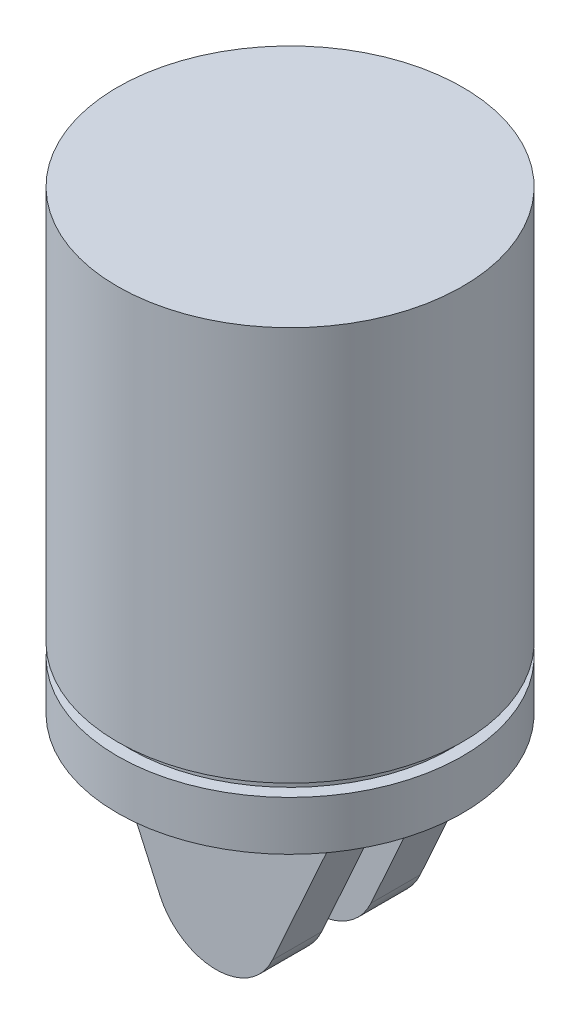
ISO-10303-21;
HEADER;
FILE_DESCRIPTION(('STEP AP214'),'2;1');
FILE_NAME('part.step','',(''),(''),'','','');
FILE_SCHEMA(('AUTOMOTIVE_DESIGN { 1 0 10303 214 1 1 1 1 }'));
ENDSEC;
DATA;
#1=APPLICATION_CONTEXT('core data for automotive mechanical design processes');
#2=APPLICATION_PROTOCOL_DEFINITION('international standard','automotive_design',2000,#1);
#3=PRODUCT_CONTEXT('',#1,'mechanical');
#4=PRODUCT('Part','Part','',(#3));
#5=PRODUCT_RELATED_PRODUCT_CATEGORY('part','',(#4));
#6=PRODUCT_DEFINITION_FORMATION('','',#4);
#7=PRODUCT_DEFINITION_CONTEXT('part definition',#1,'design');
#8=PRODUCT_DEFINITION('design','',#6,#7);
#9=PRODUCT_DEFINITION_SHAPE('','',#8);
#10=(LENGTH_UNIT() NAMED_UNIT(*) SI_UNIT(.MILLI.,.METRE.));
#11=(NAMED_UNIT(*) PLANE_ANGLE_UNIT() SI_UNIT($,.RADIAN.));
#12=(NAMED_UNIT(*) SI_UNIT($,.STERADIAN.) SOLID_ANGLE_UNIT());
#13=UNCERTAINTY_MEASURE_WITH_UNIT(LENGTH_MEASURE(1.E-05),#10,'distance_accuracy_value','');
#14=(GEOMETRIC_REPRESENTATION_CONTEXT(3) GLOBAL_UNCERTAINTY_ASSIGNED_CONTEXT((#13)) GLOBAL_UNIT_ASSIGNED_CONTEXT((#10,
#11,#12)) REPRESENTATION_CONTEXT('',''));
#15=CARTESIAN_POINT('',(0.,0.,0.));
#16=DIRECTION('',(0.,0.,1.));
#17=DIRECTION('',(1.,0.,0.));
#18=AXIS2_PLACEMENT_3D('',#15,#16,#17);
#19=CARTESIAN_POINT('',(0.,0.,15.));
#20=DIRECTION('',(0.,0.,-1.));
#21=DIRECTION('',(-1.,0.,0.));
#22=AXIS2_PLACEMENT_3D('',#19,#20,#21);
#23=CYLINDRICAL_SURFACE('',#22,12.5);
#24=CARTESIAN_POINT('',(0.,0.,5.));
#25=DIRECTION('',(0.,0.,1.));
#26=DIRECTION('',(1.,0.,0.));
#27=AXIS2_PLACEMENT_3D('',#24,#25,#26);
#28=CIRCLE('',#27,12.5);
#29=CARTESIAN_POINT('',(-11.3929728470768,-5.14297284707685,5.));
#30=VERTEX_POINT('',#29);
#31=CARTESIAN_POINT('',(11.3929728470768,-5.14297284707685,5.));
#32=VERTEX_POINT('',#31);
#33=EDGE_CURVE('E134',#30,#32,#28,.T.);
#34=ORIENTED_EDGE('',*,*,#33,.T.);
#35=DIRECTION('',(0.,0.,-1.));
#36=VECTOR('',#35,1.);
#37=CARTESIAN_POINT('',(11.3929728470768,-5.14297284707685,15.));
#38=LINE('',#37,#36);
#39=CARTESIAN_POINT('',(11.3929728470768,-5.14297284707685,15.));
#40=VERTEX_POINT('',#39);
#41=EDGE_CURVE('E42',#40,#32,#38,.T.);
#42=ORIENTED_EDGE('',*,*,#41,.F.);
#43=CARTESIAN_POINT('',(0.,0.,15.));
#44=DIRECTION('',(0.,0.,1.));
#45=DIRECTION('',(1.,0.,0.));
#46=AXIS2_PLACEMENT_3D('',#43,#44,#45);
#47=CIRCLE('',#46,12.5);
#48=CARTESIAN_POINT('',(-11.3929728470768,-5.14297284707685,15.));
#49=VERTEX_POINT('',#48);
#50=EDGE_CURVE('E136',#49,#40,#47,.T.);
#51=ORIENTED_EDGE('',*,*,#50,.F.);
#52=DIRECTION('',(0.,0.,-1.));
#53=VECTOR('',#52,1.);
#54=CARTESIAN_POINT('',(-11.3929728470768,-5.14297284707685,15.));
#55=LINE('',#54,#53);
#56=EDGE_CURVE('E146',#49,#30,#55,.T.);
#57=ORIENTED_EDGE('',*,*,#56,.T.);
#58=EDGE_LOOP('',(#34,#42,#51,#57));
#59=FACE_BOUND('',#58,.T.);
#60=ADVANCED_FACE('F39',(#59),#23,.T.);
#61=CARTESIAN_POINT('',(25.,25.,15.));
#62=DIRECTION('',(-0.911437827766148,0.411437827766148,0.));
#63=DIRECTION('',(-0.411437827766148,-0.911437827766148,0.));
#64=AXIS2_PLACEMENT_3D('',#61,#62,#63);
#65=PLANE('',#64);
#66=DIRECTION('',(0.411437827766148,0.911437827766148,0.));
#67=VECTOR('',#66,1.);
#68=CARTESIAN_POINT('',(25.,25.,5.));
#69=LINE('',#68,#67);
#70=CARTESIAN_POINT('',(25.,25.,5.));
#71=VERTEX_POINT('',#70);
#72=EDGE_CURVE('E149',#32,#71,#69,.T.);
#73=ORIENTED_EDGE('',*,*,#72,.T.);
#74=DIRECTION('',(0.,0.,-1.));
#75=VECTOR('',#74,1.);
#76=CARTESIAN_POINT('',(25.,25.,15.));
#77=LINE('',#76,#75);
#78=CARTESIAN_POINT('',(25.,25.,15.));
#79=VERTEX_POINT('',#78);
#80=EDGE_CURVE('E159',#79,#71,#77,.T.);
#81=ORIENTED_EDGE('',*,*,#80,.F.);
#82=DIRECTION('',(0.411437827766148,0.911437827766148,0.));
#83=VECTOR('',#82,1.);
#84=CARTESIAN_POINT('',(25.,25.,15.));
#85=LINE('',#84,#83);
#86=EDGE_CURVE('E139',#40,#79,#85,.T.);
#87=ORIENTED_EDGE('',*,*,#86,.F.);
#88=ORIENTED_EDGE('',*,*,#41,.T.);
#89=EDGE_LOOP('',(#73,#81,#87,#88));
#90=FACE_BOUND('',#89,.T.);
#91=ADVANCED_FACE('F167',(#90),#65,.F.);
#92=CARTESIAN_POINT('',(-11.3929728470768,-5.14297284707685,15.));
#93=DIRECTION('',(0.911437827766148,0.411437827766148,0.));
#94=DIRECTION('',(-0.411437827766148,0.911437827766148,0.));
#95=AXIS2_PLACEMENT_3D('',#92,#93,#94);
#96=PLANE('',#95);
#97=DIRECTION('',(0.411437827766148,-0.911437827766148,0.));
#98=VECTOR('',#97,1.);
#99=CARTESIAN_POINT('',(-11.3929728470768,-5.14297284707685,5.));
#100=LINE('',#99,#98);
#101=CARTESIAN_POINT('',(-25.,25.,5.));
#102=VERTEX_POINT('',#101);
#103=EDGE_CURVE('E140',#102,#30,#100,.T.);
#104=ORIENTED_EDGE('',*,*,#103,.T.);
#105=ORIENTED_EDGE('',*,*,#56,.F.);
#106=DIRECTION('',(0.411437827766148,-0.911437827766148,0.));
#107=VECTOR('',#106,1.);
#108=CARTESIAN_POINT('',(-11.3929728470768,-5.14297284707685,15.));
#109=LINE('',#108,#107);
#110=CARTESIAN_POINT('',(-25.,25.,15.));
#111=VERTEX_POINT('',#110);
#112=EDGE_CURVE('E144',#111,#49,#109,.T.);
#113=ORIENTED_EDGE('',*,*,#112,.F.);
#114=DIRECTION('',(0.,0.,-1.));
#115=VECTOR('',#114,1.);
#116=CARTESIAN_POINT('',(-25.,25.,15.));
#117=LINE('',#116,#115);
#118=EDGE_CURVE('E158',#111,#102,#117,.T.);
#119=ORIENTED_EDGE('',*,*,#118,.T.);
#120=EDGE_LOOP('',(#104,#105,#113,#119));
#121=FACE_BOUND('',#120,.T.);
#122=ADVANCED_FACE('F179',(#121),#96,.F.);
#123=CARTESIAN_POINT('',(0.,0.,15.));
#124=DIRECTION('',(0.,0.,1.));
#125=DIRECTION('',(1.,0.,0.));
#126=AXIS2_PLACEMENT_3D('',#123,#124,#125);
#127=PLANE('',#126);
#128=ORIENTED_EDGE('',*,*,#50,.T.);
#129=ORIENTED_EDGE('',*,*,#86,.T.);
#130=DIRECTION('',(-1.,0.,0.));
#131=VECTOR('',#130,1.);
#132=CARTESIAN_POINT('',(-25.,25.,15.));
#133=LINE('',#132,#131);
#134=EDGE_CURVE('E142',#79,#111,#133,.T.);
#135=ORIENTED_EDGE('',*,*,#134,.T.);
#136=ORIENTED_EDGE('',*,*,#112,.T.);
#137=EDGE_LOOP('',(#128,#129,#135,#136));
#138=FACE_BOUND('',#137,.T.);
#139=ADVANCED_FACE('F181',(#138),#127,.T.);
#140=CARTESIAN_POINT('',(0.,0.,5.));
#141=DIRECTION('',(0.,0.,1.));
#142=DIRECTION('',(1.,0.,0.));
#143=AXIS2_PLACEMENT_3D('',#140,#141,#142);
#144=PLANE('',#143);
#145=ORIENTED_EDGE('',*,*,#33,.F.);
#146=ORIENTED_EDGE('',*,*,#103,.F.);
#147=DIRECTION('',(-1.,0.,0.));
#148=VECTOR('',#147,1.);
#149=CARTESIAN_POINT('',(-25.,25.,5.));
#150=LINE('',#149,#148);
#151=EDGE_CURVE('E152',#71,#102,#150,.T.);
#152=ORIENTED_EDGE('',*,*,#151,.F.);
#153=ORIENTED_EDGE('',*,*,#72,.F.);
#154=EDGE_LOOP('',(#145,#146,#152,#153));
#155=FACE_BOUND('',#154,.T.);
#156=ADVANCED_FACE('F174',(#155),#144,.F.);
#157=CARTESIAN_POINT('',(0.,25.,0.));
#158=DIRECTION('',(0.,1.,0.));
#159=DIRECTION('',(0.,0.,1.));
#160=AXIS2_PLACEMENT_3D('',#157,#158,#159);
#161=PLANE('',#160);
#162=DIRECTION('',(0.,0.,-1.));
#163=VECTOR('',#162,1.);
#164=CARTESIAN_POINT('',(-25.,25.,-5.));
#165=LINE('',#164,#163);
#166=CARTESIAN_POINT('',(-25.,25.,-5.));
#167=VERTEX_POINT('',#166);
#168=CARTESIAN_POINT('',(-25.,25.,-15.));
#169=VERTEX_POINT('',#168);
#170=EDGE_CURVE('E59',#167,#169,#165,.T.);
#171=ORIENTED_EDGE('',*,*,#170,.F.);
#172=DIRECTION('',(-1.,0.,0.));
#173=VECTOR('',#172,1.);
#174=CARTESIAN_POINT('',(-25.,25.,-5.));
#175=LINE('',#174,#173);
#176=CARTESIAN_POINT('',(25.,25.,-5.));
#177=VERTEX_POINT('',#176);
#178=EDGE_CURVE('E54',#177,#167,#175,.T.);
#179=ORIENTED_EDGE('',*,*,#178,.F.);
#180=DIRECTION('',(0.,0.,-1.));
#181=VECTOR('',#180,1.);
#182=CARTESIAN_POINT('',(25.,25.,-5.));
#183=LINE('',#182,#181);
#184=CARTESIAN_POINT('',(25.,25.,-15.));
#185=VERTEX_POINT('',#184);
#186=EDGE_CURVE('E109',#177,#185,#183,.T.);
#187=ORIENTED_EDGE('',*,*,#186,.T.);
#188=DIRECTION('',(-1.,0.,0.));
#189=VECTOR('',#188,1.);
#190=CARTESIAN_POINT('',(-25.,25.,-15.));
#191=LINE('',#190,#189);
#192=EDGE_CURVE('E342',#185,#169,#191,.T.);
#193=ORIENTED_EDGE('',*,*,#192,.T.);
#194=EDGE_LOOP('',(#171,#179,#187,#193));
#195=FACE_BOUND('',#194,.T.);
#196=CARTESIAN_POINT('',(0.,25.,0.));
#197=DIRECTION('',(0.,1.,0.));
#198=DIRECTION('',(0.,0.,1.));
#199=AXIS2_PLACEMENT_3D('',#196,#197,#198);
#200=CIRCLE('',#199,35.);
#201=CARTESIAN_POINT('',(0.,25.,35.));
#202=VERTEX_POINT('',#201);
#203=EDGE_CURVE('E125',#202,#202,#200,.T.);
#204=ORIENTED_EDGE('',*,*,#203,.F.);
#205=EDGE_LOOP('',(#204));
#206=FACE_BOUND('',#205,.T.);
#207=ORIENTED_EDGE('',*,*,#80,.T.);
#208=ORIENTED_EDGE('',*,*,#151,.T.);
#209=ORIENTED_EDGE('',*,*,#118,.F.);
#210=ORIENTED_EDGE('',*,*,#134,.F.);
#211=EDGE_LOOP('',(#207,#208,#209,#210));
#212=FACE_BOUND('',#211,.T.);
#213=ADVANCED_FACE('F176',(#195,#206,#212),#161,.F.);
#214=CARTESIAN_POINT('',(0.,35.,0.));
#215=DIRECTION('',(0.,-1.,0.));
#216=DIRECTION('',(0.,0.,-1.));
#217=AXIS2_PLACEMENT_3D('',#214,#215,#216);
#218=CYLINDRICAL_SURFACE('',#217,35.);
#219=CARTESIAN_POINT('',(0.,35.,0.));
#220=DIRECTION('',(0.,1.,0.));
#221=DIRECTION('',(0.,0.,1.));
#222=AXIS2_PLACEMENT_3D('',#219,#220,#221);
#223=CIRCLE('',#222,35.);
#224=CARTESIAN_POINT('',(0.,35.,35.));
#225=VERTEX_POINT('',#224);
#226=EDGE_CURVE('E128',#225,#225,#223,.T.);
#227=ORIENTED_EDGE('',*,*,#226,.F.);
#228=EDGE_LOOP('',(#227));
#229=FACE_BOUND('',#228,.T.);
#230=ORIENTED_EDGE('',*,*,#203,.T.);
#231=EDGE_LOOP('',(#230));
#232=FACE_BOUND('',#231,.T.);
#233=ADVANCED_FACE('F263',(#229,#232),#218,.T.);
#234=CARTESIAN_POINT('',(0.,35.,0.));
#235=DIRECTION('',(0.,1.,0.));
#236=DIRECTION('',(0.,0.,1.));
#237=AXIS2_PLACEMENT_3D('',#234,#235,#236);
#238=PLANE('',#237);
#239=CARTESIAN_POINT('',(0.,35.,0.));
#240=DIRECTION('',(0.,1.,0.));
#241=DIRECTION('',(0.,0.,1.));
#242=AXIS2_PLACEMENT_3D('',#239,#240,#241);
#243=CIRCLE('',#242,32.5);
#244=CARTESIAN_POINT('',(0.,35.,32.5));
#245=VERTEX_POINT('',#244);
#246=EDGE_CURVE('E11',#245,#245,#243,.T.);
#247=ORIENTED_EDGE('',*,*,#246,.F.);
#248=EDGE_LOOP('',(#247));
#249=FACE_BOUND('',#248,.T.);
#250=ORIENTED_EDGE('',*,*,#226,.T.);
#251=EDGE_LOOP('',(#250));
#252=FACE_BOUND('',#251,.T.);
#253=ADVANCED_FACE('F223',(#249,#252),#238,.T.);
#254=CARTESIAN_POINT('',(0.,0.,-5.));
#255=DIRECTION('',(0.,0.,-1.));
#256=DIRECTION('',(-1.,0.,0.));
#257=AXIS2_PLACEMENT_3D('',#254,#255,#256);
#258=CYLINDRICAL_SURFACE('',#257,12.5);
#259=CARTESIAN_POINT('',(0.,0.,-15.));
#260=DIRECTION('',(0.,0.,1.));
#261=DIRECTION('',(1.,0.,0.));
#262=AXIS2_PLACEMENT_3D('',#259,#260,#261);
#263=CIRCLE('',#262,12.5);
#264=CARTESIAN_POINT('',(-11.3929728470768,-5.14297284707685,-15.));
#265=VERTEX_POINT('',#264);
#266=CARTESIAN_POINT('',(11.3929728470768,-5.14297284707685,-15.));
#267=VERTEX_POINT('',#266);
#268=EDGE_CURVE('E124',#265,#267,#263,.T.);
#269=ORIENTED_EDGE('',*,*,#268,.T.);
#270=DIRECTION('',(0.,0.,-1.));
#271=VECTOR('',#270,1.);
#272=CARTESIAN_POINT('',(11.3929728470768,-5.14297284707685,-5.));
#273=LINE('',#272,#271);
#274=CARTESIAN_POINT('',(11.3929728470768,-5.14297284707685,-5.));
#275=VERTEX_POINT('',#274);
#276=EDGE_CURVE('E107',#275,#267,#273,.T.);
#277=ORIENTED_EDGE('',*,*,#276,.F.);
#278=CARTESIAN_POINT('',(0.,0.,-5.));
#279=DIRECTION('',(0.,0.,1.));
#280=DIRECTION('',(1.,0.,0.));
#281=AXIS2_PLACEMENT_3D('',#278,#279,#280);
#282=CIRCLE('',#281,12.5);
#283=CARTESIAN_POINT('',(-11.3929728470768,-5.14297284707685,-5.));
#284=VERTEX_POINT('',#283);
#285=EDGE_CURVE('E111',#284,#275,#282,.T.);
#286=ORIENTED_EDGE('',*,*,#285,.F.);
#287=DIRECTION('',(0.,0.,-1.));
#288=VECTOR('',#287,1.);
#289=CARTESIAN_POINT('',(-11.3929728470768,-5.14297284707685,-5.));
#290=LINE('',#289,#288);
#291=EDGE_CURVE('E338',#284,#265,#290,.T.);
#292=ORIENTED_EDGE('',*,*,#291,.T.);
#293=EDGE_LOOP('',(#269,#277,#286,#292));
#294=FACE_BOUND('',#293,.T.);
#295=ADVANCED_FACE('F122',(#294),#258,.T.);
#296=CARTESIAN_POINT('',(25.,25.,-5.));
#297=DIRECTION('',(-0.911437827766148,0.411437827766148,0.));
#298=DIRECTION('',(-0.411437827766148,-0.911437827766148,0.));
#299=AXIS2_PLACEMENT_3D('',#296,#297,#298);
#300=PLANE('',#299);
#301=DIRECTION('',(0.411437827766148,0.911437827766148,0.));
#302=VECTOR('',#301,1.);
#303=CARTESIAN_POINT('',(25.,25.,-15.));
#304=LINE('',#303,#302);
#305=EDGE_CURVE('E340',#267,#185,#304,.T.);
#306=ORIENTED_EDGE('',*,*,#305,.T.);
#307=ORIENTED_EDGE('',*,*,#186,.F.);
#308=DIRECTION('',(0.411437827766148,0.911437827766148,0.));
#309=VECTOR('',#308,1.);
#310=CARTESIAN_POINT('',(25.,25.,-5.));
#311=LINE('',#310,#309);
#312=EDGE_CURVE('E102',#275,#177,#311,.T.);
#313=ORIENTED_EDGE('',*,*,#312,.F.);
#314=ORIENTED_EDGE('',*,*,#276,.T.);
#315=EDGE_LOOP('',(#306,#307,#313,#314));
#316=FACE_BOUND('',#315,.T.);
#317=ADVANCED_FACE('F105',(#316),#300,.F.);
#318=CARTESIAN_POINT('',(-11.3929728470768,-5.14297284707685,-5.));
#319=DIRECTION('',(0.911437827766148,0.411437827766148,0.));
#320=DIRECTION('',(-0.411437827766148,0.911437827766148,0.));
#321=AXIS2_PLACEMENT_3D('',#318,#319,#320);
#322=PLANE('',#321);
#323=DIRECTION('',(0.411437827766148,-0.911437827766148,0.));
#324=VECTOR('',#323,1.);
#325=CARTESIAN_POINT('',(-11.3929728470768,-5.14297284707685,-15.));
#326=LINE('',#325,#324);
#327=EDGE_CURVE('E120',#169,#265,#326,.T.);
#328=ORIENTED_EDGE('',*,*,#327,.T.);
#329=ORIENTED_EDGE('',*,*,#291,.F.);
#330=DIRECTION('',(0.411437827766148,-0.911437827766148,0.));
#331=VECTOR('',#330,1.);
#332=CARTESIAN_POINT('',(-11.3929728470768,-5.14297284707685,-5.));
#333=LINE('',#332,#331);
#334=EDGE_CURVE('E116',#167,#284,#333,.T.);
#335=ORIENTED_EDGE('',*,*,#334,.F.);
#336=ORIENTED_EDGE('',*,*,#170,.T.);
#337=EDGE_LOOP('',(#328,#329,#335,#336));
#338=FACE_BOUND('',#337,.T.);
#339=ADVANCED_FACE('F231',(#338),#322,.F.);
#340=CARTESIAN_POINT('',(0.,0.,-5.));
#341=DIRECTION('',(0.,0.,1.));
#342=DIRECTION('',(1.,0.,0.));
#343=AXIS2_PLACEMENT_3D('',#340,#341,#342);
#344=PLANE('',#343);
#345=ORIENTED_EDGE('',*,*,#285,.T.);
#346=ORIENTED_EDGE('',*,*,#312,.T.);
#347=ORIENTED_EDGE('',*,*,#178,.T.);
#348=ORIENTED_EDGE('',*,*,#334,.T.);
#349=EDGE_LOOP('',(#345,#346,#347,#348));
#350=FACE_BOUND('',#349,.T.);
#351=ADVANCED_FACE('F114',(#350),#344,.T.);
#352=CARTESIAN_POINT('',(0.,0.,-15.));
#353=DIRECTION('',(0.,0.,1.));
#354=DIRECTION('',(1.,0.,0.));
#355=AXIS2_PLACEMENT_3D('',#352,#353,#354);
#356=PLANE('',#355);
#357=ORIENTED_EDGE('',*,*,#268,.F.);
#358=ORIENTED_EDGE('',*,*,#327,.F.);
#359=ORIENTED_EDGE('',*,*,#192,.F.);
#360=ORIENTED_EDGE('',*,*,#305,.F.);
#361=EDGE_LOOP('',(#357,#358,#359,#360));
#362=FACE_BOUND('',#361,.T.);
#363=ADVANCED_FACE('F247',(#362),#356,.F.);
#364=CARTESIAN_POINT('',(0.,37.5,0.));
#365=DIRECTION('',(0.,-1.,0.));
#366=DIRECTION('',(0.,0.,-1.));
#367=AXIS2_PLACEMENT_3D('',#364,#365,#366);
#368=CYLINDRICAL_SURFACE('',#367,32.5);
#369=CARTESIAN_POINT('',(0.,37.5,0.));
#370=DIRECTION('',(0.,1.,0.));
#371=DIRECTION('',(0.,0.,1.));
#372=AXIS2_PLACEMENT_3D('',#369,#370,#371);
#373=CIRCLE('',#372,32.5);
#374=CARTESIAN_POINT('',(0.,37.5,32.5));
#375=VERTEX_POINT('',#374);
#376=EDGE_CURVE('E325',#375,#375,#373,.T.);
#377=ORIENTED_EDGE('',*,*,#376,.F.);
#378=EDGE_LOOP('',(#377));
#379=FACE_BOUND('',#378,.T.);
#380=ORIENTED_EDGE('',*,*,#246,.T.);
#381=EDGE_LOOP('',(#380));
#382=FACE_BOUND('',#381,.T.);
#383=ADVANCED_FACE('F255',(#379,#382),#368,.T.);
#384=CARTESIAN_POINT('',(0.,117.5,0.));
#385=DIRECTION('',(0.,-1.,0.));
#386=DIRECTION('',(0.,0.,-1.));
#387=AXIS2_PLACEMENT_3D('',#384,#385,#386);
#388=CYLINDRICAL_SURFACE('',#387,35.);
#389=CARTESIAN_POINT('',(0.,117.5,0.));
#390=DIRECTION('',(0.,1.,0.));
#391=DIRECTION('',(0.,0.,1.));
#392=AXIS2_PLACEMENT_3D('',#389,#390,#391);
#393=CIRCLE('',#392,35.);
#394=CARTESIAN_POINT('',(0.,117.5,35.));
#395=VERTEX_POINT('',#394);
#396=EDGE_CURVE('E330',#395,#395,#393,.T.);
#397=ORIENTED_EDGE('',*,*,#396,.F.);
#398=EDGE_LOOP('',(#397));
#399=FACE_BOUND('',#398,.T.);
#400=CARTESIAN_POINT('',(0.,37.5,0.));
#401=DIRECTION('',(0.,1.,0.));
#402=DIRECTION('',(0.,0.,1.));
#403=AXIS2_PLACEMENT_3D('',#400,#401,#402);
#404=CIRCLE('',#403,35.);
#405=CARTESIAN_POINT('',(0.,37.5,35.));
#406=VERTEX_POINT('',#405);
#407=EDGE_CURVE('E328',#406,#406,#404,.T.);
#408=ORIENTED_EDGE('',*,*,#407,.T.);
#409=EDGE_LOOP('',(#408));
#410=FACE_BOUND('',#409,.T.);
#411=ADVANCED_FACE('F289',(#399,#410),#388,.T.);
#412=CARTESIAN_POINT('',(0.,117.5,0.));
#413=DIRECTION('',(0.,1.,0.));
#414=DIRECTION('',(0.,0.,1.));
#415=AXIS2_PLACEMENT_3D('',#412,#413,#414);
#416=PLANE('',#415);
#417=ORIENTED_EDGE('',*,*,#396,.T.);
#418=EDGE_LOOP('',(#417));
#419=FACE_BOUND('',#418,.T.);
#420=ADVANCED_FACE('F299',(#419),#416,.T.);
#421=CARTESIAN_POINT('',(0.,37.5,0.));
#422=DIRECTION('',(0.,1.,0.));
#423=DIRECTION('',(0.,0.,1.));
#424=AXIS2_PLACEMENT_3D('',#421,#422,#423);
#425=PLANE('',#424);
#426=ORIENTED_EDGE('',*,*,#376,.T.);
#427=EDGE_LOOP('',(#426));
#428=FACE_BOUND('',#427,.T.);
#429=ORIENTED_EDGE('',*,*,#407,.F.);
#430=EDGE_LOOP('',(#429));
#431=FACE_BOUND('',#430,.T.);
#432=ADVANCED_FACE('F309',(#428,#431),#425,.F.);
#433=CLOSED_SHELL('',(#60,#91,#122,#139,#156,#213,#233,#253,#295,#317,#339,#351,#363,#383,#411,
#420,#432));
#434=MANIFOLD_SOLID_BREP('B2',#433);
#435=ADVANCED_BREP_SHAPE_REPRESENTATION('',(#18,#434),#14);
#436=SHAPE_DEFINITION_REPRESENTATION(#9,#435);
ENDSEC;
END-ISO-10303-21;
